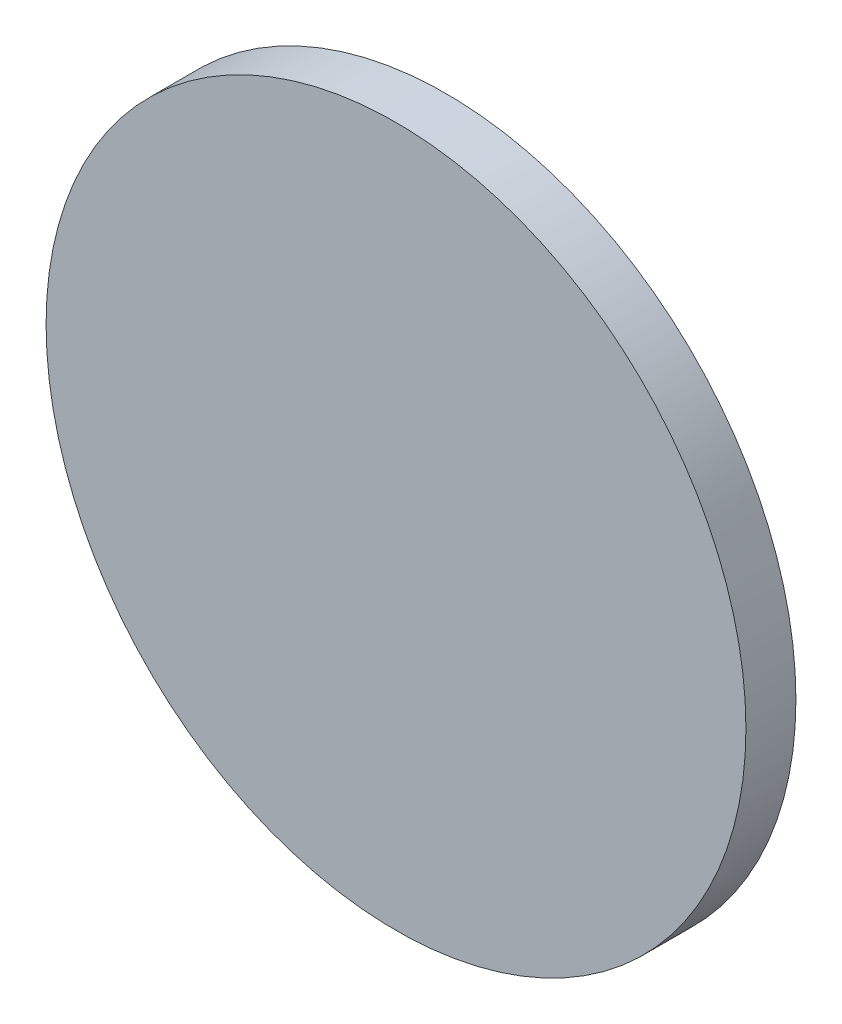
ISO-10303-21;
HEADER;
FILE_DESCRIPTION(('STEP AP214'),'2;1');
FILE_NAME('part.step','',(''),(''),'','','');
FILE_SCHEMA(('AUTOMOTIVE_DESIGN { 1 0 10303 214 1 1 1 1 }'));
ENDSEC;
DATA;
#1=APPLICATION_CONTEXT('core data for automotive mechanical design processes');
#2=APPLICATION_PROTOCOL_DEFINITION('international standard','automotive_design',2000,#1);
#3=PRODUCT_CONTEXT('',#1,'mechanical');
#4=PRODUCT('Part','Part','',(#3));
#5=PRODUCT_RELATED_PRODUCT_CATEGORY('part','',(#4));
#6=PRODUCT_DEFINITION_FORMATION('','',#4);
#7=PRODUCT_DEFINITION_CONTEXT('part definition',#1,'design');
#8=PRODUCT_DEFINITION('design','',#6,#7);
#9=PRODUCT_DEFINITION_SHAPE('','',#8);
#10=(LENGTH_UNIT() NAMED_UNIT(*) SI_UNIT(.MILLI.,.METRE.));
#11=(NAMED_UNIT(*) PLANE_ANGLE_UNIT() SI_UNIT($,.RADIAN.));
#12=(NAMED_UNIT(*) SI_UNIT($,.STERADIAN.) SOLID_ANGLE_UNIT());
#13=UNCERTAINTY_MEASURE_WITH_UNIT(LENGTH_MEASURE(1.E-05),#10,'distance_accuracy_value','');
#14=(GEOMETRIC_REPRESENTATION_CONTEXT(3) GLOBAL_UNCERTAINTY_ASSIGNED_CONTEXT((#13)) GLOBAL_UNIT_ASSIGNED_CONTEXT((#10,
#11,#12)) REPRESENTATION_CONTEXT('',''));
#15=CARTESIAN_POINT('',(0.,0.,0.));
#16=DIRECTION('',(0.,0.,1.));
#17=DIRECTION('',(1.,0.,0.));
#18=AXIS2_PLACEMENT_3D('',#15,#16,#17);
#19=CARTESIAN_POINT('',(0.,0.,1.));
#20=DIRECTION('',(0.,0.,-1.));
#21=DIRECTION('',(-1.,0.,0.));
#22=AXIS2_PLACEMENT_3D('',#19,#20,#21);
#23=CYLINDRICAL_SURFACE('',#22,7.);
#24=CARTESIAN_POINT('',(0.,0.,1.));
#25=DIRECTION('',(0.,0.,1.));
#26=DIRECTION('',(1.,0.,0.));
#27=AXIS2_PLACEMENT_3D('',#24,#25,#26);
#28=CIRCLE('',#27,7.);
#29=CARTESIAN_POINT('',(7.,0.,1.));
#30=VERTEX_POINT('',#29);
#31=EDGE_CURVE('E10',#30,#30,#28,.T.);
#32=ORIENTED_EDGE('',*,*,#31,.F.);
#33=EDGE_LOOP('',(#32));
#34=FACE_BOUND('',#33,.T.);
#35=CARTESIAN_POINT('',(0.,0.,0.));
#36=DIRECTION('',(0.,0.,1.));
#37=DIRECTION('',(1.,0.,0.));
#38=AXIS2_PLACEMENT_3D('',#35,#36,#37);
#39=CIRCLE('',#38,7.);
#40=CARTESIAN_POINT('',(7.,0.,0.));
#41=VERTEX_POINT('',#40);
#42=EDGE_CURVE('E41',#41,#41,#39,.T.);
#43=ORIENTED_EDGE('',*,*,#42,.T.);
#44=EDGE_LOOP('',(#43));
#45=FACE_BOUND('',#44,.T.);
#46=ADVANCED_FACE('F38',(#34,#45),#23,.T.);
#47=CARTESIAN_POINT('',(0.,0.,1.));
#48=DIRECTION('',(0.,0.,1.));
#49=DIRECTION('',(1.,0.,0.));
#50=AXIS2_PLACEMENT_3D('',#47,#48,#49);
#51=PLANE('',#50);
#52=ORIENTED_EDGE('',*,*,#31,.T.);
#53=EDGE_LOOP('',(#52));
#54=FACE_BOUND('',#53,.T.);
#55=ADVANCED_FACE('F53',(#54),#51,.T.);
#56=CARTESIAN_POINT('',(0.,0.,0.));
#57=DIRECTION('',(0.,0.,1.));
#58=DIRECTION('',(1.,0.,0.));
#59=AXIS2_PLACEMENT_3D('',#56,#57,#58);
#60=PLANE('',#59);
#61=ORIENTED_EDGE('',*,*,#42,.F.);
#62=EDGE_LOOP('',(#61));
#63=FACE_BOUND('',#62,.T.);
#64=ADVANCED_FACE('F51',(#63),#60,.F.);
#65=CLOSED_SHELL('',(#46,#55,#64));
#66=MANIFOLD_SOLID_BREP('B2',#65);
#67=ADVANCED_BREP_SHAPE_REPRESENTATION('',(#18,#66),#14);
#68=SHAPE_DEFINITION_REPRESENTATION(#9,#67);
ENDSEC;
END-ISO-10303-21;
